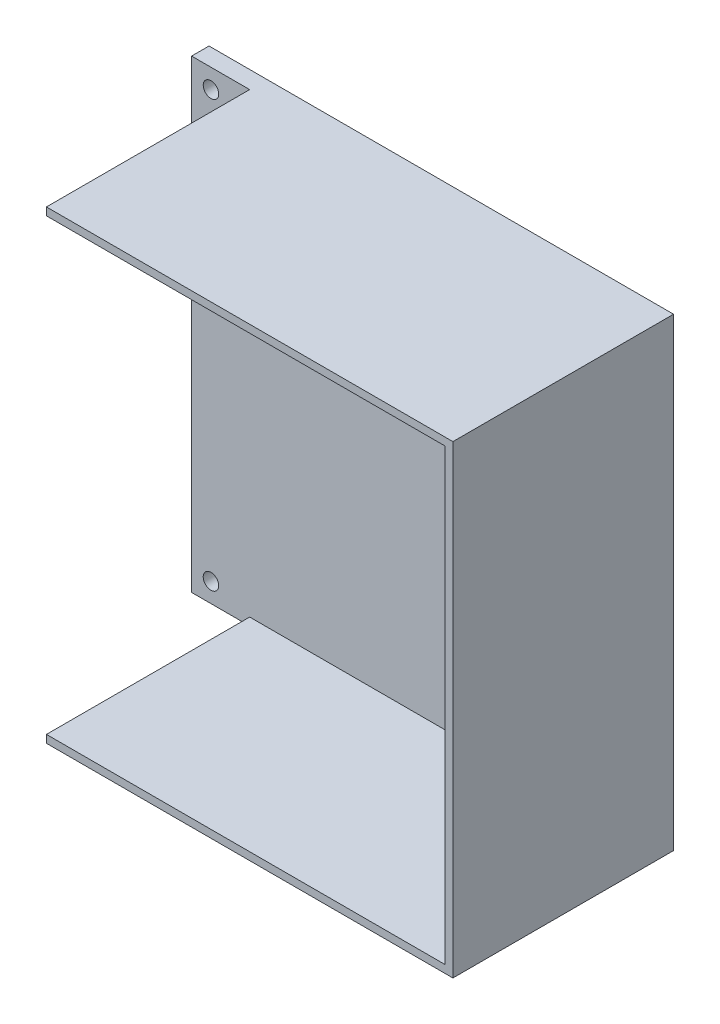
ISO-10303-21;
HEADER;
FILE_DESCRIPTION(('STEP AP214'),'2;1');
FILE_NAME('part.step','',(''),(''),'','','');
FILE_SCHEMA(('AUTOMOTIVE_DESIGN { 1 0 10303 214 1 1 1 1 }'));
ENDSEC;
DATA;
#1=APPLICATION_CONTEXT('core data for automotive mechanical design processes');
#2=APPLICATION_PROTOCOL_DEFINITION('international standard','automotive_design',2000,#1);
#3=PRODUCT_CONTEXT('',#1,'mechanical');
#4=PRODUCT('Part','Part','',(#3));
#5=PRODUCT_RELATED_PRODUCT_CATEGORY('part','',(#4));
#6=PRODUCT_DEFINITION_FORMATION('','',#4);
#7=PRODUCT_DEFINITION_CONTEXT('part definition',#1,'design');
#8=PRODUCT_DEFINITION('design','',#6,#7);
#9=PRODUCT_DEFINITION_SHAPE('','',#8);
#10=(LENGTH_UNIT() NAMED_UNIT(*) SI_UNIT(.MILLI.,.METRE.));
#11=(NAMED_UNIT(*) PLANE_ANGLE_UNIT() SI_UNIT($,.RADIAN.));
#12=(NAMED_UNIT(*) SI_UNIT($,.STERADIAN.) SOLID_ANGLE_UNIT());
#13=UNCERTAINTY_MEASURE_WITH_UNIT(LENGTH_MEASURE(1.E-05),#10,'distance_accuracy_value','');
#14=(GEOMETRIC_REPRESENTATION_CONTEXT(3) GLOBAL_UNCERTAINTY_ASSIGNED_CONTEXT((#13)) GLOBAL_UNIT_ASSIGNED_CONTEXT((#10,
#11,#12)) REPRESENTATION_CONTEXT('',''));
#15=CARTESIAN_POINT('',(0.,0.,0.));
#16=DIRECTION('',(0.,0.,1.));
#17=DIRECTION('',(1.,0.,0.));
#18=AXIS2_PLACEMENT_3D('',#15,#16,#17);
#19=CARTESIAN_POINT('',(-55.,55.,0.));
#20=DIRECTION('',(0.,0.,1.));
#21=DIRECTION('',(1.,0.,0.));
#22=AXIS2_PLACEMENT_3D('',#19,#20,#21);
#23=PLANE('',#22);
#24=CARTESIAN_POINT('',(-110.,0.,0.));
#25=DIRECTION('',(0.,0.,-1.));
#26=DIRECTION('',(1.,0.,0.));
#27=AXIS2_PLACEMENT_3D('',#24,#25,#26);
#28=CIRCLE('',#27,2.);
#29=CARTESIAN_POINT('',(-112.,0.,0.));
#30=VERTEX_POINT('',#29);
#31=EDGE_CURVE('E254',#30,#30,#28,.T.);
#32=ORIENTED_EDGE('',*,*,#31,.F.);
#33=EDGE_LOOP('',(#32));
#34=FACE_BOUND('',#33,.T.);
#35=CARTESIAN_POINT('',(-110.,110.,0.));
#36=DIRECTION('',(0.,0.,-1.));
#37=DIRECTION('',(1.,0.,0.));
#38=AXIS2_PLACEMENT_3D('',#35,#36,#37);
#39=CIRCLE('',#38,2.);
#40=CARTESIAN_POINT('',(-112.,110.,0.));
#41=VERTEX_POINT('',#40);
#42=EDGE_CURVE('E265',#41,#41,#39,.T.);
#43=ORIENTED_EDGE('',*,*,#42,.F.);
#44=EDGE_LOOP('',(#43));
#45=FACE_BOUND('',#44,.T.);
#46=CARTESIAN_POINT('',(0.,0.,0.));
#47=DIRECTION('',(0.,0.,-1.));
#48=DIRECTION('',(1.,0.,0.));
#49=AXIS2_PLACEMENT_3D('',#46,#47,#48);
#50=CIRCLE('',#49,2.);
#51=CARTESIAN_POINT('',(-2.,0.,0.));
#52=VERTEX_POINT('',#51);
#53=EDGE_CURVE('E272',#52,#52,#50,.T.);
#54=ORIENTED_EDGE('',*,*,#53,.F.);
#55=EDGE_LOOP('',(#54));
#56=FACE_BOUND('',#55,.T.);
#57=CARTESIAN_POINT('',(0.,110.,0.));
#58=DIRECTION('',(0.,0.,-1.));
#59=DIRECTION('',(1.,0.,0.));
#60=AXIS2_PLACEMENT_3D('',#57,#58,#59);
#61=CIRCLE('',#60,2.);
#62=CARTESIAN_POINT('',(-2.,110.,0.));
#63=VERTEX_POINT('',#62);
#64=EDGE_CURVE('E226',#63,#63,#61,.T.);
#65=ORIENTED_EDGE('',*,*,#64,.F.);
#66=EDGE_LOOP('',(#65));
#67=FACE_BOUND('',#66,.T.);
#68=DIRECTION('',(1.,0.,0.));
#69=VECTOR('',#68,1.);
#70=CARTESIAN_POINT('',(-115.,115.,0.));
#71=LINE('',#70,#69);
#72=CARTESIAN_POINT('',(-115.,115.,0.));
#73=VERTEX_POINT('',#72);
#74=CARTESIAN_POINT('',(5.,115.,0.));
#75=VERTEX_POINT('',#74);
#76=EDGE_CURVE('E54',#73,#75,#71,.T.);
#77=ORIENTED_EDGE('',*,*,#76,.T.);
#78=DIRECTION('',(0.,-1.,0.));
#79=VECTOR('',#78,1.);
#80=CARTESIAN_POINT('',(5.,115.,0.));
#81=LINE('',#80,#79);
#82=CARTESIAN_POINT('',(5.,-5.,0.));
#83=VERTEX_POINT('',#82);
#84=EDGE_CURVE('E229',#75,#83,#81,.T.);
#85=ORIENTED_EDGE('',*,*,#84,.T.);
#86=DIRECTION('',(-1.,0.,0.));
#87=VECTOR('',#86,1.);
#88=CARTESIAN_POINT('',(5.,-5.,0.));
#89=LINE('',#88,#87);
#90=CARTESIAN_POINT('',(-115.,-5.,0.));
#91=VERTEX_POINT('',#90);
#92=EDGE_CURVE('E212',#83,#91,#89,.T.);
#93=ORIENTED_EDGE('',*,*,#92,.T.);
#94=DIRECTION('',(0.,1.,0.));
#95=VECTOR('',#94,1.);
#96=CARTESIAN_POINT('',(-115.,-5.,0.));
#97=LINE('',#96,#95);
#98=EDGE_CURVE('E211',#91,#73,#97,.T.);
#99=ORIENTED_EDGE('',*,*,#98,.T.);
#100=EDGE_LOOP('',(#77,#85,#93,#99));
#101=FACE_BOUND('',#100,.T.);
#102=ADVANCED_FACE('F47',(#34,#45,#56,#67,#101),#23,.F.);
#103=CARTESIAN_POINT('',(5.,115.,0.));
#104=DIRECTION('',(0.,1.,0.));
#105=DIRECTION('',(1.,0.,0.));
#106=AXIS2_PLACEMENT_3D('',#103,#104,#105);
#107=PLANE('',#106);
#108=DIRECTION('',(1.,0.,0.));
#109=VECTOR('',#108,1.);
#110=CARTESIAN_POINT('',(-100.,115.,57.));
#111=LINE('',#110,#109);
#112=CARTESIAN_POINT('',(-100.,115.,57.));
#113=VERTEX_POINT('',#112);
#114=CARTESIAN_POINT('',(5.,115.,57.));
#115=VERTEX_POINT('',#114);
#116=EDGE_CURVE('E165',#113,#115,#111,.T.);
#117=ORIENTED_EDGE('',*,*,#116,.T.);
#118=DIRECTION('',(0.,0.,1.));
#119=VECTOR('',#118,1.);
#120=CARTESIAN_POINT('',(5.,115.,0.));
#121=LINE('',#120,#119);
#122=EDGE_CURVE('E258',#75,#115,#121,.T.);
#123=ORIENTED_EDGE('',*,*,#122,.F.);
#124=ORIENTED_EDGE('',*,*,#76,.F.);
#125=DIRECTION('',(0.,0.,1.));
#126=VECTOR('',#125,1.);
#127=CARTESIAN_POINT('',(-115.,115.,0.));
#128=LINE('',#127,#126);
#129=CARTESIAN_POINT('',(-115.,115.,4.5));
#130=VERTEX_POINT('',#129);
#131=EDGE_CURVE('E290',#73,#130,#128,.T.);
#132=ORIENTED_EDGE('',*,*,#131,.T.);
#133=DIRECTION('',(-1.,0.,0.));
#134=VECTOR('',#133,1.);
#135=CARTESIAN_POINT('',(-115.,115.,4.5));
#136=LINE('',#135,#134);
#137=CARTESIAN_POINT('',(-100.,115.,4.5));
#138=VERTEX_POINT('',#137);
#139=EDGE_CURVE('E184',#138,#130,#136,.T.);
#140=ORIENTED_EDGE('',*,*,#139,.F.);
#141=DIRECTION('',(0.,0.,1.));
#142=VECTOR('',#141,1.);
#143=CARTESIAN_POINT('',(-100.,115.,80.));
#144=LINE('',#143,#142);
#145=EDGE_CURVE('E178',#138,#113,#144,.T.);
#146=ORIENTED_EDGE('',*,*,#145,.T.);
#147=EDGE_LOOP('',(#117,#123,#124,#132,#140,#146));
#148=FACE_BOUND('',#147,.T.);
#149=ADVANCED_FACE('F182',(#148),#107,.T.);
#150=CARTESIAN_POINT('',(-115.,115.,0.));
#151=DIRECTION('',(-1.,0.,0.));
#152=DIRECTION('',(0.,0.,1.));
#153=AXIS2_PLACEMENT_3D('',#150,#151,#152);
#154=PLANE('',#153);
#155=ORIENTED_EDGE('',*,*,#98,.F.);
#156=DIRECTION('',(0.,0.,1.));
#157=VECTOR('',#156,1.);
#158=CARTESIAN_POINT('',(-115.,-5.,0.));
#159=LINE('',#158,#157);
#160=CARTESIAN_POINT('',(-115.,-5.,4.5));
#161=VERTEX_POINT('',#160);
#162=EDGE_CURVE('E208',#91,#161,#159,.T.);
#163=ORIENTED_EDGE('',*,*,#162,.T.);
#164=DIRECTION('',(0.,-1.,0.));
#165=VECTOR('',#164,1.);
#166=CARTESIAN_POINT('',(-115.,-5.,4.5));
#167=LINE('',#166,#165);
#168=EDGE_CURVE('E213',#130,#161,#167,.T.);
#169=ORIENTED_EDGE('',*,*,#168,.F.);
#170=ORIENTED_EDGE('',*,*,#131,.F.);
#171=EDGE_LOOP('',(#155,#163,#169,#170));
#172=FACE_BOUND('',#171,.T.);
#173=ADVANCED_FACE('F308',(#172),#154,.T.);
#174=CARTESIAN_POINT('',(-115.,-5.,0.));
#175=DIRECTION('',(0.,-1.,0.));
#176=DIRECTION('',(0.,0.,-1.));
#177=AXIS2_PLACEMENT_3D('',#174,#175,#176);
#178=PLANE('',#177);
#179=DIRECTION('',(1.,0.,0.));
#180=VECTOR('',#179,1.);
#181=CARTESIAN_POINT('',(-100.,-5.,57.));
#182=LINE('',#181,#180);
#183=CARTESIAN_POINT('',(-100.,-5.,57.));
#184=VERTEX_POINT('',#183);
#185=CARTESIAN_POINT('',(5.,-5.,57.));
#186=VERTEX_POINT('',#185);
#187=EDGE_CURVE('E172',#184,#186,#182,.T.);
#188=ORIENTED_EDGE('',*,*,#187,.F.);
#189=DIRECTION('',(0.,0.,-1.));
#190=VECTOR('',#189,1.);
#191=CARTESIAN_POINT('',(-100.,-5.,80.));
#192=LINE('',#191,#190);
#193=CARTESIAN_POINT('',(-100.,-5.,4.5));
#194=VERTEX_POINT('',#193);
#195=EDGE_CURVE('E221',#184,#194,#192,.T.);
#196=ORIENTED_EDGE('',*,*,#195,.T.);
#197=DIRECTION('',(1.,0.,0.));
#198=VECTOR('',#197,1.);
#199=CARTESIAN_POINT('',(5.,-5.,4.5));
#200=LINE('',#199,#198);
#201=EDGE_CURVE('E217',#161,#194,#200,.T.);
#202=ORIENTED_EDGE('',*,*,#201,.F.);
#203=ORIENTED_EDGE('',*,*,#162,.F.);
#204=ORIENTED_EDGE('',*,*,#92,.F.);
#205=DIRECTION('',(0.,0.,1.));
#206=VECTOR('',#205,1.);
#207=CARTESIAN_POINT('',(5.,-5.,0.));
#208=LINE('',#207,#206);
#209=EDGE_CURVE('E261',#83,#186,#208,.T.);
#210=ORIENTED_EDGE('',*,*,#209,.T.);
#211=EDGE_LOOP('',(#188,#196,#202,#203,#204,#210));
#212=FACE_BOUND('',#211,.T.);
#213=ADVANCED_FACE('F302',(#212),#178,.T.);
#214=CARTESIAN_POINT('',(5.,-5.,0.));
#215=DIRECTION('',(1.,0.,0.));
#216=DIRECTION('',(0.,1.,0.));
#217=AXIS2_PLACEMENT_3D('',#214,#215,#216);
#218=PLANE('',#217);
#219=DIRECTION('',(0.,-1.,0.));
#220=VECTOR('',#219,1.);
#221=CARTESIAN_POINT('',(5.,115.,57.));
#222=LINE('',#221,#220);
#223=EDGE_CURVE('E168',#115,#186,#222,.T.);
#224=ORIENTED_EDGE('',*,*,#223,.T.);
#225=ORIENTED_EDGE('',*,*,#209,.F.);
#226=ORIENTED_EDGE('',*,*,#84,.F.);
#227=ORIENTED_EDGE('',*,*,#122,.T.);
#228=EDGE_LOOP('',(#224,#225,#226,#227));
#229=FACE_BOUND('',#228,.T.);
#230=ADVANCED_FACE('F299',(#229),#218,.T.);
#231=CARTESIAN_POINT('',(0.,110.,0.));
#232=DIRECTION('',(0.,0.,1.));
#233=DIRECTION('',(1.,0.,0.));
#234=AXIS2_PLACEMENT_3D('',#231,#232,#233);
#235=CYLINDRICAL_SURFACE('',#234,2.);
#236=CARTESIAN_POINT('',(0.,110.,4.5));
#237=DIRECTION('',(0.,0.,-1.));
#238=DIRECTION('',(1.,0.,0.));
#239=AXIS2_PLACEMENT_3D('',#236,#237,#238);
#240=CIRCLE('',#239,2.);
#241=CARTESIAN_POINT('',(-2.,110.,4.5));
#242=VERTEX_POINT('',#241);
#243=EDGE_CURVE('E234',#242,#242,#240,.T.);
#244=ORIENTED_EDGE('',*,*,#243,.F.);
#245=DIRECTION('',(0.,0.,-1.));
#246=VECTOR('',#245,1.);
#247=CARTESIAN_POINT('',(-2.,110.,0.));
#248=LINE('',#247,#246);
#249=EDGE_CURVE('E230',#242,#63,#248,.T.);
#250=ORIENTED_EDGE('',*,*,#249,.T.);
#251=ORIENTED_EDGE('',*,*,#64,.T.);
#252=ORIENTED_EDGE('',*,*,#249,.F.);
#253=EDGE_LOOP('',(#244,#250,#251,#252));
#254=FACE_BOUND('',#253,.T.);
#255=ADVANCED_FACE('F371',(#254),#235,.F.);
#256=CARTESIAN_POINT('',(0.,0.,0.));
#257=DIRECTION('',(0.,0.,1.));
#258=DIRECTION('',(1.,0.,0.));
#259=AXIS2_PLACEMENT_3D('',#256,#257,#258);
#260=CYLINDRICAL_SURFACE('',#259,2.);
#261=CARTESIAN_POINT('',(0.,0.,4.5));
#262=DIRECTION('',(0.,0.,-1.));
#263=DIRECTION('',(1.,0.,0.));
#264=AXIS2_PLACEMENT_3D('',#261,#262,#263);
#265=CIRCLE('',#264,2.);
#266=CARTESIAN_POINT('',(-2.,0.,4.5));
#267=VERTEX_POINT('',#266);
#268=EDGE_CURVE('E238',#267,#267,#265,.T.);
#269=ORIENTED_EDGE('',*,*,#268,.F.);
#270=DIRECTION('',(0.,0.,-1.));
#271=VECTOR('',#270,1.);
#272=CARTESIAN_POINT('',(-2.,0.,0.));
#273=LINE('',#272,#271);
#274=EDGE_CURVE('E268',#267,#52,#273,.T.);
#275=ORIENTED_EDGE('',*,*,#274,.T.);
#276=ORIENTED_EDGE('',*,*,#53,.T.);
#277=ORIENTED_EDGE('',*,*,#274,.F.);
#278=EDGE_LOOP('',(#269,#275,#276,#277));
#279=FACE_BOUND('',#278,.T.);
#280=ADVANCED_FACE('F391',(#279),#260,.F.);
#281=CARTESIAN_POINT('',(-110.,110.,0.));
#282=DIRECTION('',(0.,0.,1.));
#283=DIRECTION('',(1.,0.,0.));
#284=AXIS2_PLACEMENT_3D('',#281,#282,#283);
#285=CYLINDRICAL_SURFACE('',#284,2.);
#286=CARTESIAN_POINT('',(-110.,110.,4.5));
#287=DIRECTION('',(0.,0.,-1.));
#288=DIRECTION('',(1.,0.,0.));
#289=AXIS2_PLACEMENT_3D('',#286,#287,#288);
#290=CIRCLE('',#289,2.);
#291=CARTESIAN_POINT('',(-112.,110.,4.5));
#292=VERTEX_POINT('',#291);
#293=EDGE_CURVE('E246',#292,#292,#290,.T.);
#294=ORIENTED_EDGE('',*,*,#293,.F.);
#295=DIRECTION('',(0.,0.,-1.));
#296=VECTOR('',#295,1.);
#297=CARTESIAN_POINT('',(-112.,110.,0.));
#298=LINE('',#297,#296);
#299=EDGE_CURVE('E257',#292,#41,#298,.T.);
#300=ORIENTED_EDGE('',*,*,#299,.T.);
#301=ORIENTED_EDGE('',*,*,#42,.T.);
#302=ORIENTED_EDGE('',*,*,#299,.F.);
#303=EDGE_LOOP('',(#294,#300,#301,#302));
#304=FACE_BOUND('',#303,.T.);
#305=ADVANCED_FACE('F384',(#304),#285,.F.);
#306=CARTESIAN_POINT('',(-110.,0.,0.));
#307=DIRECTION('',(0.,0.,1.));
#308=DIRECTION('',(1.,0.,0.));
#309=AXIS2_PLACEMENT_3D('',#306,#307,#308);
#310=CYLINDRICAL_SURFACE('',#309,2.);
#311=CARTESIAN_POINT('',(-110.,0.,4.5));
#312=DIRECTION('',(0.,0.,-1.));
#313=DIRECTION('',(1.,0.,0.));
#314=AXIS2_PLACEMENT_3D('',#311,#312,#313);
#315=CIRCLE('',#314,2.);
#316=CARTESIAN_POINT('',(-112.,0.,4.5));
#317=VERTEX_POINT('',#316);
#318=EDGE_CURVE('E242',#317,#317,#315,.T.);
#319=ORIENTED_EDGE('',*,*,#318,.F.);
#320=DIRECTION('',(0.,0.,-1.));
#321=VECTOR('',#320,1.);
#322=CARTESIAN_POINT('',(-112.,0.,0.));
#323=LINE('',#322,#321);
#324=EDGE_CURVE('E250',#317,#30,#323,.T.);
#325=ORIENTED_EDGE('',*,*,#324,.T.);
#326=ORIENTED_EDGE('',*,*,#31,.T.);
#327=ORIENTED_EDGE('',*,*,#324,.F.);
#328=EDGE_LOOP('',(#319,#325,#326,#327));
#329=FACE_BOUND('',#328,.T.);
#330=ADVANCED_FACE('F374',(#329),#310,.F.);
#331=CARTESIAN_POINT('',(-55.,55.,4.5));
#332=DIRECTION('',(0.,0.,1.));
#333=DIRECTION('',(1.,0.,0.));
#334=AXIS2_PLACEMENT_3D('',#331,#332,#333);
#335=PLANE('',#334);
#336=ORIENTED_EDGE('',*,*,#293,.T.);
#337=EDGE_LOOP('',(#336));
#338=FACE_BOUND('',#337,.T.);
#339=ORIENTED_EDGE('',*,*,#318,.T.);
#340=EDGE_LOOP('',(#339));
#341=FACE_BOUND('',#340,.T.);
#342=ORIENTED_EDGE('',*,*,#268,.T.);
#343=EDGE_LOOP('',(#342));
#344=FACE_BOUND('',#343,.T.);
#345=ORIENTED_EDGE('',*,*,#243,.T.);
#346=EDGE_LOOP('',(#345));
#347=FACE_BOUND('',#346,.T.);
#348=DIRECTION('',(0.,1.,0.));
#349=VECTOR('',#348,1.);
#350=CARTESIAN_POINT('',(-100.,25.,4.5));
#351=LINE('',#350,#349);
#352=CARTESIAN_POINT('',(-100.,-3.,4.5));
#353=VERTEX_POINT('',#352);
#354=EDGE_CURVE('E193',#194,#353,#351,.T.);
#355=ORIENTED_EDGE('',*,*,#354,.T.);
#356=DIRECTION('',(-1.,0.,0.));
#357=VECTOR('',#356,1.);
#358=CARTESIAN_POINT('',(-22.75,-3.,4.5));
#359=LINE('',#358,#357);
#360=CARTESIAN_POINT('',(3.,-3.,4.5));
#361=VERTEX_POINT('',#360);
#362=EDGE_CURVE('E201',#361,#353,#359,.T.);
#363=ORIENTED_EDGE('',*,*,#362,.F.);
#364=DIRECTION('',(0.,-1.,0.));
#365=VECTOR('',#364,1.);
#366=CARTESIAN_POINT('',(3.,84.,4.5));
#367=LINE('',#366,#365);
#368=CARTESIAN_POINT('',(3.,113.,4.5));
#369=VERTEX_POINT('',#368);
#370=EDGE_CURVE('E188',#369,#361,#367,.T.);
#371=ORIENTED_EDGE('',*,*,#370,.F.);
#372=DIRECTION('',(1.,0.,0.));
#373=VECTOR('',#372,1.);
#374=CARTESIAN_POINT('',(-74.25,113.,4.5));
#375=LINE('',#374,#373);
#376=CARTESIAN_POINT('',(-100.,113.,4.5));
#377=VERTEX_POINT('',#376);
#378=EDGE_CURVE('E314',#377,#369,#375,.T.);
#379=ORIENTED_EDGE('',*,*,#378,.F.);
#380=DIRECTION('',(0.,1.,0.));
#381=VECTOR('',#380,1.);
#382=CARTESIAN_POINT('',(-100.,25.,4.5));
#383=LINE('',#382,#381);
#384=EDGE_CURVE('E187',#377,#138,#383,.T.);
#385=ORIENTED_EDGE('',*,*,#384,.T.);
#386=ORIENTED_EDGE('',*,*,#139,.T.);
#387=ORIENTED_EDGE('',*,*,#168,.T.);
#388=ORIENTED_EDGE('',*,*,#201,.T.);
#389=EDGE_LOOP('',(#355,#363,#371,#379,#385,#386,#387,#388));
#390=FACE_BOUND('',#389,.T.);
#391=ADVANCED_FACE('F310',(#338,#341,#344,#347,#390),#335,.T.);
#392=CARTESIAN_POINT('',(-100.,-5.,4.5));
#393=DIRECTION('',(-1.,0.,0.));
#394=DIRECTION('',(0.,0.,1.));
#395=AXIS2_PLACEMENT_3D('',#392,#393,#394);
#396=PLANE('',#395);
#397=DIRECTION('',(0.,-1.,0.));
#398=VECTOR('',#397,1.);
#399=CARTESIAN_POINT('',(-100.,115.,57.));
#400=LINE('',#399,#398);
#401=CARTESIAN_POINT('',(-100.,-2.99999999999998,57.));
#402=VERTEX_POINT('',#401);
#403=EDGE_CURVE('E171',#402,#184,#400,.T.);
#404=ORIENTED_EDGE('',*,*,#403,.F.);
#405=DIRECTION('',(0.,0.,-1.));
#406=VECTOR('',#405,1.);
#407=CARTESIAN_POINT('',(-100.,-3.,42.25));
#408=LINE('',#407,#406);
#409=EDGE_CURVE('E203',#402,#353,#408,.T.);
#410=ORIENTED_EDGE('',*,*,#409,.T.);
#411=ORIENTED_EDGE('',*,*,#354,.F.);
#412=ORIENTED_EDGE('',*,*,#195,.F.);
#413=EDGE_LOOP('',(#404,#410,#411,#412));
#414=FACE_BOUND('',#413,.T.);
#415=ADVANCED_FACE('F337',(#414),#396,.T.);
#416=CARTESIAN_POINT('',(-100.,-5.,4.5));
#417=DIRECTION('',(-1.,0.,0.));
#418=DIRECTION('',(0.,0.,1.));
#419=AXIS2_PLACEMENT_3D('',#416,#417,#418);
#420=PLANE('',#419);
#421=CARTESIAN_POINT('',(-100.,113.,57.));
#422=VERTEX_POINT('',#421);
#423=EDGE_CURVE('E61',#113,#422,#400,.T.);
#424=ORIENTED_EDGE('',*,*,#423,.F.);
#425=ORIENTED_EDGE('',*,*,#145,.F.);
#426=ORIENTED_EDGE('',*,*,#384,.F.);
#427=DIRECTION('',(0.,0.,1.));
#428=VECTOR('',#427,1.);
#429=CARTESIAN_POINT('',(-100.,113.,42.25));
#430=LINE('',#429,#428);
#431=EDGE_CURVE('E180',#377,#422,#430,.T.);
#432=ORIENTED_EDGE('',*,*,#431,.T.);
#433=EDGE_LOOP('',(#424,#425,#426,#432));
#434=FACE_BOUND('',#433,.T.);
#435=ADVANCED_FACE('F177',(#434),#420,.T.);
#436=CARTESIAN_POINT('',(3.,113.,80.));
#437=DIRECTION('',(1.,0.,0.));
#438=DIRECTION('',(0.,1.,0.));
#439=AXIS2_PLACEMENT_3D('',#436,#437,#438);
#440=PLANE('',#439);
#441=DIRECTION('',(0.,0.,-1.));
#442=VECTOR('',#441,1.);
#443=CARTESIAN_POINT('',(3.,-3.,80.));
#444=LINE('',#443,#442);
#445=CARTESIAN_POINT('',(3.,-3.,57.));
#446=VERTEX_POINT('',#445);
#447=EDGE_CURVE('E197',#446,#361,#444,.T.);
#448=ORIENTED_EDGE('',*,*,#447,.F.);
#449=DIRECTION('',(0.,1.,0.));
#450=VECTOR('',#449,1.);
#451=CARTESIAN_POINT('',(3.,113.,57.));
#452=LINE('',#451,#450);
#453=CARTESIAN_POINT('',(3.,113.,57.));
#454=VERTEX_POINT('',#453);
#455=EDGE_CURVE('E330',#446,#454,#452,.T.);
#456=ORIENTED_EDGE('',*,*,#455,.T.);
#457=DIRECTION('',(0.,0.,-1.));
#458=VECTOR('',#457,1.);
#459=CARTESIAN_POINT('',(3.,113.,80.));
#460=LINE('',#459,#458);
#461=EDGE_CURVE('E319',#454,#369,#460,.T.);
#462=ORIENTED_EDGE('',*,*,#461,.T.);
#463=ORIENTED_EDGE('',*,*,#370,.T.);
#464=EDGE_LOOP('',(#448,#456,#462,#463));
#465=FACE_BOUND('',#464,.T.);
#466=ADVANCED_FACE('F344',(#465),#440,.F.);
#467=CARTESIAN_POINT('',(3.,-3.,80.));
#468=DIRECTION('',(0.,-1.,0.));
#469=DIRECTION('',(0.,0.,-1.));
#470=AXIS2_PLACEMENT_3D('',#467,#468,#469);
#471=PLANE('',#470);
#472=ORIENTED_EDGE('',*,*,#409,.F.);
#473=DIRECTION('',(1.,0.,0.));
#474=VECTOR('',#473,1.);
#475=CARTESIAN_POINT('',(3.,-3.,57.));
#476=LINE('',#475,#474);
#477=EDGE_CURVE('E327',#402,#446,#476,.T.);
#478=ORIENTED_EDGE('',*,*,#477,.T.);
#479=ORIENTED_EDGE('',*,*,#447,.T.);
#480=ORIENTED_EDGE('',*,*,#362,.T.);
#481=EDGE_LOOP('',(#472,#478,#479,#480));
#482=FACE_BOUND('',#481,.T.);
#483=ADVANCED_FACE('F340',(#482),#471,.F.);
#484=CARTESIAN_POINT('',(-100.,113.,80.));
#485=DIRECTION('',(0.,1.,0.));
#486=DIRECTION('',(1.,0.,0.));
#487=AXIS2_PLACEMENT_3D('',#484,#485,#486);
#488=PLANE('',#487);
#489=ORIENTED_EDGE('',*,*,#461,.F.);
#490=DIRECTION('',(-1.,0.,0.));
#491=VECTOR('',#490,1.);
#492=CARTESIAN_POINT('',(-100.,113.,57.));
#493=LINE('',#492,#491);
#494=EDGE_CURVE('E11',#454,#422,#493,.T.);
#495=ORIENTED_EDGE('',*,*,#494,.T.);
#496=ORIENTED_EDGE('',*,*,#431,.F.);
#497=ORIENTED_EDGE('',*,*,#378,.T.);
#498=EDGE_LOOP('',(#489,#495,#496,#497));
#499=FACE_BOUND('',#498,.T.);
#500=ADVANCED_FACE('F317',(#499),#488,.F.);
#501=CARTESIAN_POINT('',(-100.,115.,57.));
#502=DIRECTION('',(0.,0.,-1.));
#503=DIRECTION('',(-1.,0.,0.));
#504=AXIS2_PLACEMENT_3D('',#501,#502,#503);
#505=PLANE('',#504);
#506=ORIENTED_EDGE('',*,*,#403,.T.);
#507=ORIENTED_EDGE('',*,*,#187,.T.);
#508=ORIENTED_EDGE('',*,*,#223,.F.);
#509=ORIENTED_EDGE('',*,*,#116,.F.);
#510=ORIENTED_EDGE('',*,*,#423,.T.);
#511=ORIENTED_EDGE('',*,*,#494,.F.);
#512=ORIENTED_EDGE('',*,*,#455,.F.);
#513=ORIENTED_EDGE('',*,*,#477,.F.);
#514=EDGE_LOOP('',(#506,#507,#508,#509,#510,#511,#512,#513));
#515=FACE_BOUND('',#514,.T.);
#516=ADVANCED_FACE('F166',(#515),#505,.F.);
#517=CLOSED_SHELL('',(#102,#149,#173,#213,#230,#255,#280,#305,#330,#391,#415,#435,#466,#483,
#500,#516));
#518=MANIFOLD_SOLID_BREP('B2',#517);
#519=ADVANCED_BREP_SHAPE_REPRESENTATION('',(#18,#518),#14);
#520=SHAPE_DEFINITION_REPRESENTATION(#9,#519);
ENDSEC;
END-ISO-10303-21;
